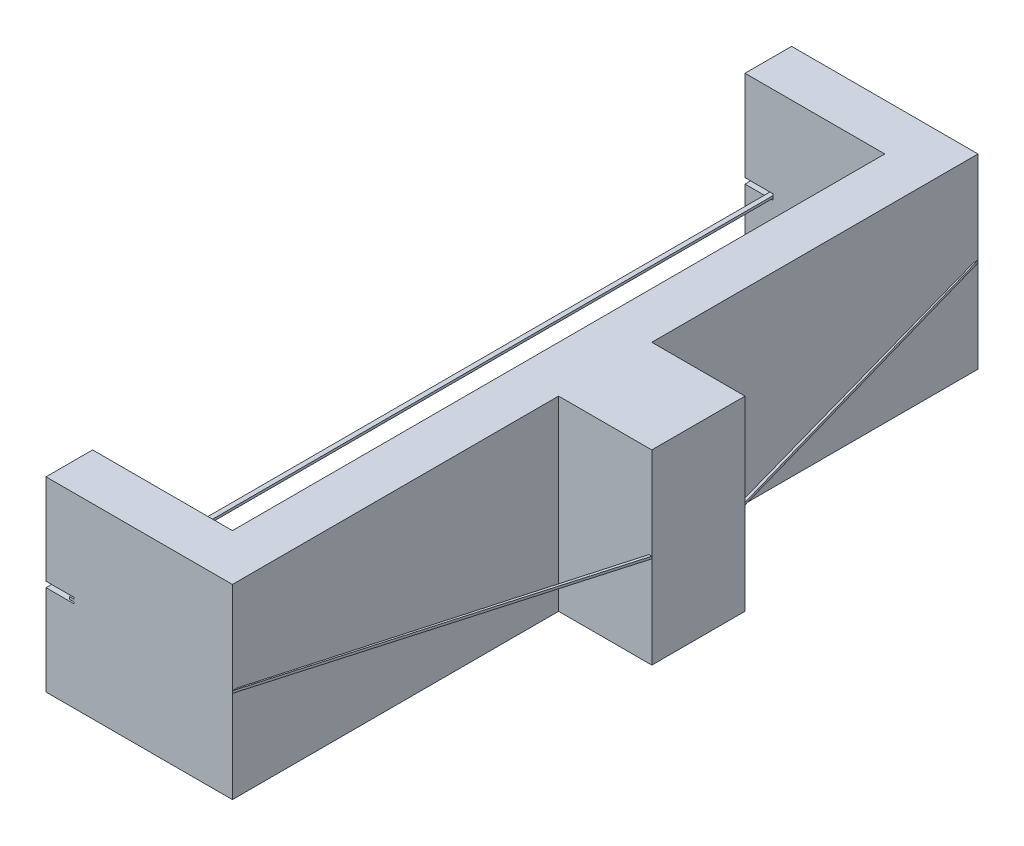
ISO-10303-21;
HEADER;
FILE_DESCRIPTION(('STEP AP214'),'2;1');
FILE_NAME('part.step','',(''),(''),'','','');
FILE_SCHEMA(('AUTOMOTIVE_DESIGN { 1 0 10303 214 1 1 1 1 }'));
ENDSEC;
DATA;
#1=APPLICATION_CONTEXT('core data for automotive mechanical design processes');
#2=APPLICATION_PROTOCOL_DEFINITION('international standard','automotive_design',2000,#1);
#3=PRODUCT_CONTEXT('',#1,'mechanical');
#4=PRODUCT('Part','Part','',(#3));
#5=PRODUCT_RELATED_PRODUCT_CATEGORY('part','',(#4));
#6=PRODUCT_DEFINITION_FORMATION('','',#4);
#7=PRODUCT_DEFINITION_CONTEXT('part definition',#1,'design');
#8=PRODUCT_DEFINITION('design','',#6,#7);
#9=PRODUCT_DEFINITION_SHAPE('','',#8);
#10=(LENGTH_UNIT() NAMED_UNIT(*) SI_UNIT(.MILLI.,.METRE.));
#11=(NAMED_UNIT(*) PLANE_ANGLE_UNIT() SI_UNIT($,.RADIAN.));
#12=(NAMED_UNIT(*) SI_UNIT($,.STERADIAN.) SOLID_ANGLE_UNIT());
#13=UNCERTAINTY_MEASURE_WITH_UNIT(LENGTH_MEASURE(1.E-05),#10,'distance_accuracy_value','');
#14=(GEOMETRIC_REPRESENTATION_CONTEXT(3) GLOBAL_UNCERTAINTY_ASSIGNED_CONTEXT((#13)) GLOBAL_UNIT_ASSIGNED_CONTEXT((#10,
#11,#12)) REPRESENTATION_CONTEXT('',''));
#15=CARTESIAN_POINT('',(0.,0.,0.));
#16=DIRECTION('',(0.,0.,1.));
#17=DIRECTION('',(1.,0.,0.));
#18=AXIS2_PLACEMENT_3D('',#15,#16,#17);
#19=CARTESIAN_POINT('',(10.,10.,5.));
#20=DIRECTION('',(-1.,0.,0.));
#21=DIRECTION('',(0.,-1.,0.));
#22=AXIS2_PLACEMENT_3D('',#19,#20,#21);
#23=PLANE('',#22);
#24=DIRECTION('',(0.,0.,1.));
#25=VECTOR('',#24,1.);
#26=CARTESIAN_POINT('',(10.,-0.125,0.));
#27=LINE('',#26,#25);
#28=CARTESIAN_POINT('',(10.,-0.125,0.));
#29=VERTEX_POINT('',#28);
#30=CARTESIAN_POINT('',(10.,-0.125,0.500000000000024));
#31=VERTEX_POINT('',#30);
#32=EDGE_CURVE('E55',#29,#31,#27,.T.);
#33=ORIENTED_EDGE('',*,*,#32,.T.);
#34=DIRECTION('',(0.,1.,0.));
#35=VECTOR('',#34,1.);
#36=CARTESIAN_POINT('',(9.99999999999999,-0.125,0.5));
#37=LINE('',#36,#35);
#38=CARTESIAN_POINT('',(10.,0.125,0.500000000000023));
#39=VERTEX_POINT('',#38);
#40=EDGE_CURVE('E59',#31,#39,#37,.T.);
#41=ORIENTED_EDGE('',*,*,#40,.T.);
#42=DIRECTION('',(0.,0.,1.));
#43=VECTOR('',#42,1.);
#44=CARTESIAN_POINT('',(10.,0.125,0.));
#45=LINE('',#44,#43);
#46=CARTESIAN_POINT('',(10.,0.125,0.));
#47=VERTEX_POINT('',#46);
#48=EDGE_CURVE('E280',#47,#39,#45,.T.);
#49=ORIENTED_EDGE('',*,*,#48,.F.);
#50=DIRECTION('',(0.,1.,0.));
#51=VECTOR('',#50,1.);
#52=CARTESIAN_POINT('',(10.,10.,0.));
#53=LINE('',#52,#51);
#54=CARTESIAN_POINT('',(10.,10.,0.));
#55=VERTEX_POINT('',#54);
#56=EDGE_CURVE('E564',#47,#55,#53,.T.);
#57=ORIENTED_EDGE('',*,*,#56,.T.);
#58=DIRECTION('',(0.,0.,-1.));
#59=VECTOR('',#58,1.);
#60=CARTESIAN_POINT('',(10.,10.,5.));
#61=LINE('',#60,#59);
#62=CARTESIAN_POINT('',(10.,10.,35.));
#63=VERTEX_POINT('',#62);
#64=EDGE_CURVE('E574',#63,#55,#61,.T.);
#65=ORIENTED_EDGE('',*,*,#64,.F.);
#66=DIRECTION('',(0.,1.,0.));
#67=VECTOR('',#66,1.);
#68=CARTESIAN_POINT('',(10.,-10.,35.));
#69=LINE('',#68,#67);
#70=CARTESIAN_POINT('',(10.,-10.,35.));
#71=VERTEX_POINT('',#70);
#72=EDGE_CURVE('E377',#71,#63,#69,.T.);
#73=ORIENTED_EDGE('',*,*,#72,.F.);
#74=DIRECTION('',(0.,0.,-1.));
#75=VECTOR('',#74,1.);
#76=CARTESIAN_POINT('',(10.,-10.,5.));
#77=LINE('',#76,#75);
#78=CARTESIAN_POINT('',(10.,-10.,0.));
#79=VERTEX_POINT('',#78);
#80=EDGE_CURVE('E579',#71,#79,#77,.T.);
#81=ORIENTED_EDGE('',*,*,#80,.T.);
#82=EDGE_CURVE('E565',#79,#29,#53,.T.);
#83=ORIENTED_EDGE('',*,*,#82,.T.);
#84=EDGE_LOOP('',(#33,#41,#49,#57,#65,#73,#81,#83));
#85=FACE_BOUND('',#84,.T.);
#86=ADVANCED_FACE('F39',(#85),#23,.F.);
#87=CARTESIAN_POINT('',(20.,-10.,35.));
#88=DIRECTION('',(0.,0.,1.));
#89=DIRECTION('',(1.,0.,0.));
#90=AXIS2_PLACEMENT_3D('',#87,#88,#89);
#91=PLANE('',#90);
#92=DIRECTION('',(1.,0.,0.));
#93=VECTOR('',#92,1.);
#94=CARTESIAN_POINT('',(19.7,-0.125,35.));
#95=LINE('',#94,#93);
#96=CARTESIAN_POINT('',(19.7,-0.125,35.));
#97=VERTEX_POINT('',#96);
#98=CARTESIAN_POINT('',(20.,-0.125,35.));
#99=VERTEX_POINT('',#98);
#100=EDGE_CURVE('E297',#97,#99,#95,.T.);
#101=ORIENTED_EDGE('',*,*,#100,.T.);
#102=DIRECTION('',(0.,1.,0.));
#103=VECTOR('',#102,1.);
#104=CARTESIAN_POINT('',(20.,-10.,35.));
#105=LINE('',#104,#103);
#106=CARTESIAN_POINT('',(20.,-10.,35.));
#107=VERTEX_POINT('',#106);
#108=EDGE_CURVE('E366',#107,#99,#105,.T.);
#109=ORIENTED_EDGE('',*,*,#108,.F.);
#110=DIRECTION('',(-1.,0.,0.));
#111=VECTOR('',#110,1.);
#112=CARTESIAN_POINT('',(20.,-10.,35.));
#113=LINE('',#112,#111);
#114=EDGE_CURVE('E388',#107,#71,#113,.T.);
#115=ORIENTED_EDGE('',*,*,#114,.T.);
#116=ORIENTED_EDGE('',*,*,#72,.T.);
#117=DIRECTION('',(-1.,0.,0.));
#118=VECTOR('',#117,1.);
#119=CARTESIAN_POINT('',(20.,10.,35.));
#120=LINE('',#119,#118);
#121=CARTESIAN_POINT('',(20.,10.,35.));
#122=VERTEX_POINT('',#121);
#123=EDGE_CURVE('E384',#122,#63,#120,.T.);
#124=ORIENTED_EDGE('',*,*,#123,.F.);
#125=CARTESIAN_POINT('',(20.,0.125,35.));
#126=VERTEX_POINT('',#125);
#127=EDGE_CURVE('E285',#126,#122,#105,.T.);
#128=ORIENTED_EDGE('',*,*,#127,.F.);
#129=DIRECTION('',(1.,0.,0.));
#130=VECTOR('',#129,1.);
#131=CARTESIAN_POINT('',(19.7,0.125,35.));
#132=LINE('',#131,#130);
#133=CARTESIAN_POINT('',(19.7,0.125,35.));
#134=VERTEX_POINT('',#133);
#135=EDGE_CURVE('E278',#134,#126,#132,.T.);
#136=ORIENTED_EDGE('',*,*,#135,.F.);
#137=DIRECTION('',(0.,1.,0.));
#138=VECTOR('',#137,1.);
#139=CARTESIAN_POINT('',(19.7,-0.125,35.));
#140=LINE('',#139,#138);
#141=EDGE_CURVE('E262',#97,#134,#140,.T.);
#142=ORIENTED_EDGE('',*,*,#141,.F.);
#143=EDGE_LOOP('',(#101,#109,#115,#116,#124,#128,#136,#142));
#144=FACE_BOUND('',#143,.T.);
#145=ADVANCED_FACE('F283',(#144),#91,.F.);
#146=DIRECTION('',(0.,1.,0.));
#147=VECTOR('',#146,1.);
#148=CARTESIAN_POINT('',(10.,-0.125,79.5));
#149=LINE('',#148,#147);
#150=CARTESIAN_POINT('',(10.,-0.125,79.5));
#151=VERTEX_POINT('',#150);
#152=CARTESIAN_POINT('',(10.,0.125,79.5));
#153=VERTEX_POINT('',#152);
#154=EDGE_CURVE('E344',#151,#153,#149,.T.);
#155=ORIENTED_EDGE('',*,*,#154,.F.);
#156=DIRECTION('',(0.,0.,1.));
#157=VECTOR('',#156,1.);
#158=CARTESIAN_POINT('',(10.,-0.125,79.5));
#159=LINE('',#158,#157);
#160=CARTESIAN_POINT('',(10.,-0.125,80.));
#161=VERTEX_POINT('',#160);
#162=EDGE_CURVE('E328',#151,#161,#159,.T.);
#163=ORIENTED_EDGE('',*,*,#162,.T.);
#164=DIRECTION('',(0.,1.,0.));
#165=VECTOR('',#164,1.);
#166=CARTESIAN_POINT('',(10.,10.,80.));
#167=LINE('',#166,#165);
#168=CARTESIAN_POINT('',(10.,-10.,80.));
#169=VERTEX_POINT('',#168);
#170=EDGE_CURVE('E491',#169,#161,#167,.T.);
#171=ORIENTED_EDGE('',*,*,#170,.F.);
#172=CARTESIAN_POINT('',(10.,-10.,45.));
#173=VERTEX_POINT('',#172);
#174=EDGE_CURVE('E580',#169,#173,#77,.T.);
#175=ORIENTED_EDGE('',*,*,#174,.T.);
#176=DIRECTION('',(0.,-1.,0.));
#177=VECTOR('',#176,1.);
#178=CARTESIAN_POINT('',(10.,-10.,45.));
#179=LINE('',#178,#177);
#180=CARTESIAN_POINT('',(10.,10.,45.));
#181=VERTEX_POINT('',#180);
#182=EDGE_CURVE('E347',#181,#173,#179,.T.);
#183=ORIENTED_EDGE('',*,*,#182,.F.);
#184=CARTESIAN_POINT('',(10.,10.,80.));
#185=VERTEX_POINT('',#184);
#186=EDGE_CURVE('E575',#185,#181,#61,.T.);
#187=ORIENTED_EDGE('',*,*,#186,.F.);
#188=CARTESIAN_POINT('',(10.,0.125,80.));
#189=VERTEX_POINT('',#188);
#190=EDGE_CURVE('E496',#189,#185,#167,.T.);
#191=ORIENTED_EDGE('',*,*,#190,.F.);
#192=DIRECTION('',(0.,0.,1.));
#193=VECTOR('',#192,1.);
#194=CARTESIAN_POINT('',(10.,0.125,79.5));
#195=LINE('',#194,#193);
#196=EDGE_CURVE('E308',#153,#189,#195,.T.);
#197=ORIENTED_EDGE('',*,*,#196,.F.);
#198=EDGE_LOOP('',(#155,#163,#171,#175,#183,#187,#191,#197));
#199=FACE_BOUND('',#198,.T.);
#200=ADVANCED_FACE('F651',(#199),#23,.F.);
#201=CARTESIAN_POINT('',(-7.,0.299999999999999,-9.99999999999998));
#202=DIRECTION('',(1.,0.,0.));
#203=DIRECTION('',(0.,0.,-1.));
#204=AXIS2_PLACEMENT_3D('',#201,#202,#203);
#205=PLANE('',#204);
#206=DIRECTION('',(0.,0.,1.));
#207=VECTOR('',#206,1.);
#208=CARTESIAN_POINT('',(-7.,-0.125,0.));
#209=LINE('',#208,#207);
#210=CARTESIAN_POINT('',(-7.,-0.125,75.));
#211=VERTEX_POINT('',#210);
#212=CARTESIAN_POINT('',(-7.,-0.125,80.));
#213=VERTEX_POINT('',#212);
#214=EDGE_CURVE('E396',#211,#213,#209,.T.);
#215=ORIENTED_EDGE('',*,*,#214,.F.);
#216=DIRECTION('',(0.,-1.,0.));
#217=VECTOR('',#216,1.);
#218=CARTESIAN_POINT('',(-7.,0.,75.));
#219=LINE('',#218,#217);
#220=CARTESIAN_POINT('',(-7.,-0.300000000000001,75.));
#221=VERTEX_POINT('',#220);
#222=EDGE_CURVE('E590',#211,#221,#219,.T.);
#223=ORIENTED_EDGE('',*,*,#222,.T.);
#224=DIRECTION('',(0.,0.,1.));
#225=VECTOR('',#224,1.);
#226=CARTESIAN_POINT('',(-7.,-0.300000000000001,-9.99999999999998));
#227=LINE('',#226,#225);
#228=CARTESIAN_POINT('',(-7.,-0.300000000000001,80.));
#229=VERTEX_POINT('',#228);
#230=EDGE_CURVE('E459',#221,#229,#227,.T.);
#231=ORIENTED_EDGE('',*,*,#230,.T.);
#232=DIRECTION('',(0.,1.,0.));
#233=VECTOR('',#232,1.);
#234=CARTESIAN_POINT('',(-7.,0.299999999999999,80.));
#235=LINE('',#234,#233);
#236=EDGE_CURVE('E441',#229,#213,#235,.T.);
#237=ORIENTED_EDGE('',*,*,#236,.T.);
#238=EDGE_LOOP('',(#215,#223,#231,#237));
#239=FACE_BOUND('',#238,.T.);
#240=ADVANCED_FACE('F730',(#239),#205,.F.);
#241=DIRECTION('',(0.,0.,-1.));
#242=VECTOR('',#241,1.);
#243=CARTESIAN_POINT('',(-7.,0.125,0.));
#244=LINE('',#243,#242);
#245=CARTESIAN_POINT('',(-7.,0.125,80.));
#246=VERTEX_POINT('',#245);
#247=CARTESIAN_POINT('',(-7.,0.125,75.));
#248=VERTEX_POINT('',#247);
#249=EDGE_CURVE('E402',#246,#248,#244,.T.);
#250=ORIENTED_EDGE('',*,*,#249,.F.);
#251=CARTESIAN_POINT('',(-7.,0.299999999999999,80.));
#252=VERTEX_POINT('',#251);
#253=EDGE_CURVE('E440',#246,#252,#235,.T.);
#254=ORIENTED_EDGE('',*,*,#253,.T.);
#255=DIRECTION('',(0.,0.,1.));
#256=VECTOR('',#255,1.);
#257=CARTESIAN_POINT('',(-7.,0.299999999999999,-9.99999999999998));
#258=LINE('',#257,#256);
#259=CARTESIAN_POINT('',(-7.,0.299999999999999,75.));
#260=VERTEX_POINT('',#259);
#261=EDGE_CURVE('E454',#260,#252,#258,.T.);
#262=ORIENTED_EDGE('',*,*,#261,.F.);
#263=EDGE_CURVE('E591',#260,#248,#219,.T.);
#264=ORIENTED_EDGE('',*,*,#263,.T.);
#265=EDGE_LOOP('',(#250,#254,#262,#264));
#266=FACE_BOUND('',#265,.T.);
#267=ADVANCED_FACE('F604',(#266),#205,.F.);
#268=CARTESIAN_POINT('',(-7.,-0.125,0.));
#269=VERTEX_POINT('',#268);
#270=CARTESIAN_POINT('',(-7.,-0.125,5.));
#271=VERTEX_POINT('',#270);
#272=EDGE_CURVE('E412',#269,#271,#209,.T.);
#273=ORIENTED_EDGE('',*,*,#272,.F.);
#274=DIRECTION('',(0.,1.,0.));
#275=VECTOR('',#274,1.);
#276=CARTESIAN_POINT('',(-7.,0.,0.));
#277=LINE('',#276,#275);
#278=CARTESIAN_POINT('',(-7.,-0.300000000000001,0.));
#279=VERTEX_POINT('',#278);
#280=EDGE_CURVE('E473',#279,#269,#277,.T.);
#281=ORIENTED_EDGE('',*,*,#280,.F.);
#282=CARTESIAN_POINT('',(-7.,-0.300000000000001,5.));
#283=VERTEX_POINT('',#282);
#284=EDGE_CURVE('E458',#279,#283,#227,.T.);
#285=ORIENTED_EDGE('',*,*,#284,.T.);
#286=DIRECTION('',(0.,1.,0.));
#287=VECTOR('',#286,1.);
#288=CARTESIAN_POINT('',(-7.,0.,5.));
#289=LINE('',#288,#287);
#290=EDGE_CURVE('E478',#283,#271,#289,.T.);
#291=ORIENTED_EDGE('',*,*,#290,.T.);
#292=EDGE_LOOP('',(#273,#281,#285,#291));
#293=FACE_BOUND('',#292,.T.);
#294=ADVANCED_FACE('F759',(#293),#205,.F.);
#295=DIRECTION('',(0.,0.,-1.));
#296=VECTOR('',#295,1.);
#297=CARTESIAN_POINT('',(-7.,0.125,-9.99999999999998));
#298=LINE('',#297,#296);
#299=CARTESIAN_POINT('',(-7.,0.125,5.));
#300=VERTEX_POINT('',#299);
#301=CARTESIAN_POINT('',(-7.,0.125,0.));
#302=VERTEX_POINT('',#301);
#303=EDGE_CURVE('E11',#300,#302,#298,.T.);
#304=ORIENTED_EDGE('',*,*,#303,.F.);
#305=CARTESIAN_POINT('',(-7.,0.299999999999999,5.));
#306=VERTEX_POINT('',#305);
#307=EDGE_CURVE('E477',#300,#306,#289,.T.);
#308=ORIENTED_EDGE('',*,*,#307,.T.);
#309=CARTESIAN_POINT('',(-7.,0.299999999999999,0.));
#310=VERTEX_POINT('',#309);
#311=EDGE_CURVE('E453',#310,#306,#258,.T.);
#312=ORIENTED_EDGE('',*,*,#311,.F.);
#313=EDGE_CURVE('E472',#302,#310,#277,.T.);
#314=ORIENTED_EDGE('',*,*,#313,.F.);
#315=EDGE_LOOP('',(#304,#308,#312,#314));
#316=FACE_BOUND('',#315,.T.);
#317=ADVANCED_FACE('F718',(#316),#205,.F.);
#318=CARTESIAN_POINT('',(-10.,10.,5.));
#319=DIRECTION('',(1.,0.,0.));
#320=DIRECTION('',(0.,0.,-1.));
#321=AXIS2_PLACEMENT_3D('',#318,#319,#320);
#322=PLANE('',#321);
#323=DIRECTION('',(0.,-1.,0.));
#324=VECTOR('',#323,1.);
#325=CARTESIAN_POINT('',(-10.,10.,0.));
#326=LINE('',#325,#324);
#327=CARTESIAN_POINT('',(-10.,10.,0.));
#328=VERTEX_POINT('',#327);
#329=CARTESIAN_POINT('',(-10.,0.299999999999999,0.));
#330=VERTEX_POINT('',#329);
#331=EDGE_CURVE('E556',#328,#330,#326,.T.);
#332=ORIENTED_EDGE('',*,*,#331,.T.);
#333=DIRECTION('',(0.,0.,1.));
#334=VECTOR('',#333,1.);
#335=CARTESIAN_POINT('',(-10.,0.299999999999999,-9.99999999999998));
#336=LINE('',#335,#334);
#337=CARTESIAN_POINT('',(-10.,0.299999999999999,5.));
#338=VERTEX_POINT('',#337);
#339=EDGE_CURVE('E452',#330,#338,#336,.T.);
#340=ORIENTED_EDGE('',*,*,#339,.T.);
#341=DIRECTION('',(0.,-1.,0.));
#342=VECTOR('',#341,1.);
#343=CARTESIAN_POINT('',(-10.,10.,5.));
#344=LINE('',#343,#342);
#345=CARTESIAN_POINT('',(-10.,10.,5.));
#346=VERTEX_POINT('',#345);
#347=EDGE_CURVE('E544',#346,#338,#344,.T.);
#348=ORIENTED_EDGE('',*,*,#347,.F.);
#349=DIRECTION('',(0.,0.,-1.));
#350=VECTOR('',#349,1.);
#351=CARTESIAN_POINT('',(-10.,10.,5.));
#352=LINE('',#351,#350);
#353=EDGE_CURVE('E555',#346,#328,#352,.T.);
#354=ORIENTED_EDGE('',*,*,#353,.T.);
#355=EDGE_LOOP('',(#332,#340,#348,#354));
#356=FACE_BOUND('',#355,.T.);
#357=ADVANCED_FACE('F711',(#356),#322,.F.);
#358=CARTESIAN_POINT('',(-10.,10.,80.));
#359=DIRECTION('',(1.,0.,0.));
#360=DIRECTION('',(0.,0.,-1.));
#361=AXIS2_PLACEMENT_3D('',#358,#359,#360);
#362=PLANE('',#361);
#363=DIRECTION('',(0.,-1.,0.));
#364=VECTOR('',#363,1.);
#365=CARTESIAN_POINT('',(-10.,10.,75.));
#366=LINE('',#365,#364);
#367=CARTESIAN_POINT('',(-10.,10.,75.));
#368=VERTEX_POINT('',#367);
#369=CARTESIAN_POINT('',(-10.,0.299999999999999,75.));
#370=VERTEX_POINT('',#369);
#371=EDGE_CURVE('E512',#368,#370,#366,.T.);
#372=ORIENTED_EDGE('',*,*,#371,.T.);
#373=CARTESIAN_POINT('',(-10.,0.299999999999999,80.));
#374=VERTEX_POINT('',#373);
#375=EDGE_CURVE('E448',#370,#374,#336,.T.);
#376=ORIENTED_EDGE('',*,*,#375,.T.);
#377=DIRECTION('',(0.,-1.,0.));
#378=VECTOR('',#377,1.);
#379=CARTESIAN_POINT('',(-10.,10.,80.));
#380=LINE('',#379,#378);
#381=CARTESIAN_POINT('',(-10.,10.,80.));
#382=VERTEX_POINT('',#381);
#383=EDGE_CURVE('E500',#382,#374,#380,.T.);
#384=ORIENTED_EDGE('',*,*,#383,.F.);
#385=DIRECTION('',(0.,0.,-1.));
#386=VECTOR('',#385,1.);
#387=CARTESIAN_POINT('',(-10.,10.,80.));
#388=LINE('',#387,#386);
#389=EDGE_CURVE('E523',#382,#368,#388,.T.);
#390=ORIENTED_EDGE('',*,*,#389,.T.);
#391=EDGE_LOOP('',(#372,#376,#384,#390));
#392=FACE_BOUND('',#391,.T.);
#393=ADVANCED_FACE('F765',(#392),#362,.F.);
#394=CARTESIAN_POINT('',(-10.,-0.300000000000001,5.));
#395=VERTEX_POINT('',#394);
#396=CARTESIAN_POINT('',(-10.,-10.,5.));
#397=VERTEX_POINT('',#396);
#398=EDGE_CURVE('E549',#395,#397,#344,.T.);
#399=ORIENTED_EDGE('',*,*,#398,.F.);
#400=DIRECTION('',(0.,0.,1.));
#401=VECTOR('',#400,1.);
#402=CARTESIAN_POINT('',(-10.,-0.300000000000001,-9.99999999999998));
#403=LINE('',#402,#401);
#404=CARTESIAN_POINT('',(-10.,-0.300000000000001,0.));
#405=VERTEX_POINT('',#404);
#406=EDGE_CURVE('E462',#405,#395,#403,.T.);
#407=ORIENTED_EDGE('',*,*,#406,.F.);
#408=CARTESIAN_POINT('',(-10.,-10.,0.));
#409=VERTEX_POINT('',#408);
#410=EDGE_CURVE('E543',#405,#409,#326,.T.);
#411=ORIENTED_EDGE('',*,*,#410,.T.);
#412=DIRECTION('',(0.,0.,-1.));
#413=VECTOR('',#412,1.);
#414=CARTESIAN_POINT('',(-10.,-10.,5.));
#415=LINE('',#414,#413);
#416=EDGE_CURVE('E583',#397,#409,#415,.T.);
#417=ORIENTED_EDGE('',*,*,#416,.F.);
#418=EDGE_LOOP('',(#399,#407,#411,#417));
#419=FACE_BOUND('',#418,.T.);
#420=ADVANCED_FACE('F41',(#419),#322,.F.);
#421=CARTESIAN_POINT('',(-10.,-10.,5.));
#422=DIRECTION('',(0.,1.,0.));
#423=DIRECTION('',(0.,0.,1.));
#424=AXIS2_PLACEMENT_3D('',#421,#422,#423);
#425=PLANE('',#424);
#426=DIRECTION('',(1.,0.,0.));
#427=VECTOR('',#426,1.);
#428=CARTESIAN_POINT('',(-10.,-10.,0.));
#429=LINE('',#428,#427);
#430=EDGE_CURVE('E560',#409,#79,#429,.T.);
#431=ORIENTED_EDGE('',*,*,#430,.T.);
#432=ORIENTED_EDGE('',*,*,#80,.F.);
#433=ORIENTED_EDGE('',*,*,#114,.F.);
#434=DIRECTION('',(0.,0.,-1.));
#435=VECTOR('',#434,1.);
#436=CARTESIAN_POINT('',(20.,-10.,45.));
#437=LINE('',#436,#435);
#438=CARTESIAN_POINT('',(20.,-10.,45.));
#439=VERTEX_POINT('',#438);
#440=EDGE_CURVE('E362',#439,#107,#437,.T.);
#441=ORIENTED_EDGE('',*,*,#440,.F.);
#442=DIRECTION('',(-1.,0.,0.));
#443=VECTOR('',#442,1.);
#444=CARTESIAN_POINT('',(20.,-10.,45.));
#445=LINE('',#444,#443);
#446=EDGE_CURVE('E392',#439,#173,#445,.T.);
#447=ORIENTED_EDGE('',*,*,#446,.T.);
#448=ORIENTED_EDGE('',*,*,#174,.F.);
#449=DIRECTION('',(1.,0.,0.));
#450=VECTOR('',#449,1.);
#451=CARTESIAN_POINT('',(10.,-10.,80.));
#452=LINE('',#451,#450);
#453=CARTESIAN_POINT('',(-10.,-10.,80.));
#454=VERTEX_POINT('',#453);
#455=EDGE_CURVE('E504',#454,#169,#452,.T.);
#456=ORIENTED_EDGE('',*,*,#455,.F.);
#457=DIRECTION('',(0.,0.,-1.));
#458=VECTOR('',#457,1.);
#459=CARTESIAN_POINT('',(-10.,-10.,80.));
#460=LINE('',#459,#458);
#461=CARTESIAN_POINT('',(-10.,-10.,75.));
#462=VERTEX_POINT('',#461);
#463=EDGE_CURVE('E508',#454,#462,#460,.T.);
#464=ORIENTED_EDGE('',*,*,#463,.T.);
#465=DIRECTION('',(1.,0.,0.));
#466=VECTOR('',#465,1.);
#467=CARTESIAN_POINT('',(10.,-10.,75.));
#468=LINE('',#467,#466);
#469=CARTESIAN_POINT('',(5.,-10.,75.));
#470=VERTEX_POINT('',#469);
#471=EDGE_CURVE('E516',#462,#470,#468,.T.);
#472=ORIENTED_EDGE('',*,*,#471,.T.);
#473=DIRECTION('',(0.,0.,-1.));
#474=VECTOR('',#473,1.);
#475=CARTESIAN_POINT('',(5.,-10.,75.));
#476=LINE('',#475,#474);
#477=CARTESIAN_POINT('',(5.,-10.,5.));
#478=VERTEX_POINT('',#477);
#479=EDGE_CURVE('E532',#470,#478,#476,.T.);
#480=ORIENTED_EDGE('',*,*,#479,.T.);
#481=DIRECTION('',(1.,0.,0.));
#482=VECTOR('',#481,1.);
#483=CARTESIAN_POINT('',(-10.,-10.,5.));
#484=LINE('',#483,#482);
#485=EDGE_CURVE('E548',#397,#478,#484,.T.);
#486=ORIENTED_EDGE('',*,*,#485,.F.);
#487=ORIENTED_EDGE('',*,*,#416,.T.);
#488=EDGE_LOOP('',(#431,#432,#433,#441,#447,#448,#456,#464,#472,#480,#486,#487));
#489=FACE_BOUND('',#488,.T.);
#490=ADVANCED_FACE('F642',(#489),#425,.F.);
#491=CARTESIAN_POINT('',(-10.,10.,5.));
#492=DIRECTION('',(0.,-1.,0.));
#493=DIRECTION('',(0.,0.,-1.));
#494=AXIS2_PLACEMENT_3D('',#491,#492,#493);
#495=PLANE('',#494);
#496=DIRECTION('',(-1.,0.,0.));
#497=VECTOR('',#496,1.);
#498=CARTESIAN_POINT('',(-10.,10.,0.));
#499=LINE('',#498,#497);
#500=EDGE_CURVE('E568',#55,#328,#499,.T.);
#501=ORIENTED_EDGE('',*,*,#500,.T.);
#502=ORIENTED_EDGE('',*,*,#353,.F.);
#503=DIRECTION('',(-1.,0.,0.));
#504=VECTOR('',#503,1.);
#505=CARTESIAN_POINT('',(-10.,10.,5.));
#506=LINE('',#505,#504);
#507=CARTESIAN_POINT('',(5.,10.,5.));
#508=VERTEX_POINT('',#507);
#509=EDGE_CURVE('E552',#508,#346,#506,.T.);
#510=ORIENTED_EDGE('',*,*,#509,.F.);
#511=DIRECTION('',(0.,0.,-1.));
#512=VECTOR('',#511,1.);
#513=CARTESIAN_POINT('',(5.,10.,75.));
#514=LINE('',#513,#512);
#515=CARTESIAN_POINT('',(5.,10.,75.));
#516=VERTEX_POINT('',#515);
#517=EDGE_CURVE('E539',#516,#508,#514,.T.);
#518=ORIENTED_EDGE('',*,*,#517,.F.);
#519=DIRECTION('',(-1.,0.,0.));
#520=VECTOR('',#519,1.);
#521=CARTESIAN_POINT('',(10.,10.,75.));
#522=LINE('',#521,#520);
#523=EDGE_CURVE('E490',#516,#368,#522,.T.);
#524=ORIENTED_EDGE('',*,*,#523,.T.);
#525=ORIENTED_EDGE('',*,*,#389,.F.);
#526=DIRECTION('',(-1.,0.,0.));
#527=VECTOR('',#526,1.);
#528=CARTESIAN_POINT('',(10.,10.,80.));
#529=LINE('',#528,#527);
#530=EDGE_CURVE('E495',#185,#382,#529,.T.);
#531=ORIENTED_EDGE('',*,*,#530,.F.);
#532=ORIENTED_EDGE('',*,*,#186,.T.);
#533=DIRECTION('',(-1.,0.,0.));
#534=VECTOR('',#533,1.);
#535=CARTESIAN_POINT('',(20.,10.,45.));
#536=LINE('',#535,#534);
#537=CARTESIAN_POINT('',(20.,10.,45.));
#538=VERTEX_POINT('',#537);
#539=EDGE_CURVE('E373',#538,#181,#536,.T.);
#540=ORIENTED_EDGE('',*,*,#539,.F.);
#541=DIRECTION('',(0.,0.,1.));
#542=VECTOR('',#541,1.);
#543=CARTESIAN_POINT('',(20.,10.,45.));
#544=LINE('',#543,#542);
#545=EDGE_CURVE('E370',#122,#538,#544,.T.);
#546=ORIENTED_EDGE('',*,*,#545,.F.);
#547=ORIENTED_EDGE('',*,*,#123,.T.);
#548=ORIENTED_EDGE('',*,*,#64,.T.);
#549=EDGE_LOOP('',(#501,#502,#510,#518,#524,#525,#531,#532,#540,#546,#547,#548));
#550=FACE_BOUND('',#549,.T.);
#551=ADVANCED_FACE('F656',(#550),#495,.F.);
#552=CARTESIAN_POINT('',(0.,0.,5.));
#553=DIRECTION('',(0.,0.,1.));
#554=DIRECTION('',(1.,0.,0.));
#555=AXIS2_PLACEMENT_3D('',#552,#553,#554);
#556=PLANE('',#555);
#557=DIRECTION('',(-1.,0.,0.));
#558=VECTOR('',#557,1.);
#559=CARTESIAN_POINT('',(0.,0.299999999999999,5.));
#560=LINE('',#559,#558);
#561=EDGE_CURVE('E487',#306,#338,#560,.T.);
#562=ORIENTED_EDGE('',*,*,#561,.F.);
#563=ORIENTED_EDGE('',*,*,#307,.F.);
#564=EDGE_CURVE('E483',#271,#300,#289,.T.);
#565=ORIENTED_EDGE('',*,*,#564,.F.);
#566=ORIENTED_EDGE('',*,*,#290,.F.);
#567=DIRECTION('',(1.,0.,0.));
#568=VECTOR('',#567,1.);
#569=CARTESIAN_POINT('',(0.,-0.3,5.));
#570=LINE('',#569,#568);
#571=EDGE_CURVE('E469',#395,#283,#570,.T.);
#572=ORIENTED_EDGE('',*,*,#571,.F.);
#573=ORIENTED_EDGE('',*,*,#398,.T.);
#574=ORIENTED_EDGE('',*,*,#485,.T.);
#575=DIRECTION('',(0.,-1.,0.));
#576=VECTOR('',#575,1.);
#577=CARTESIAN_POINT('',(5.,-10.,5.));
#578=LINE('',#577,#576);
#579=EDGE_CURVE('E527',#508,#478,#578,.T.);
#580=ORIENTED_EDGE('',*,*,#579,.F.);
#581=ORIENTED_EDGE('',*,*,#509,.T.);
#582=ORIENTED_EDGE('',*,*,#347,.T.);
#583=EDGE_LOOP('',(#562,#563,#565,#566,#572,#573,#574,#580,#581,#582));
#584=FACE_BOUND('',#583,.T.);
#585=ADVANCED_FACE('F683',(#584),#556,.T.);
#586=CARTESIAN_POINT('',(0.,0.,0.));
#587=DIRECTION('',(0.,0.,1.));
#588=DIRECTION('',(1.,0.,0.));
#589=AXIS2_PLACEMENT_3D('',#586,#587,#588);
#590=PLANE('',#589);
#591=ORIENTED_EDGE('',*,*,#280,.T.);
#592=DIRECTION('',(1.,0.,0.));
#593=VECTOR('',#592,1.);
#594=CARTESIAN_POINT('',(-7.5,-0.125,0.));
#595=LINE('',#594,#593);
#596=CARTESIAN_POINT('',(-7.5,-0.125,0.));
#597=VERTEX_POINT('',#596);
#598=EDGE_CURVE('E432',#597,#269,#595,.T.);
#599=ORIENTED_EDGE('',*,*,#598,.F.);
#600=DIRECTION('',(0.,-1.,0.));
#601=VECTOR('',#600,1.);
#602=CARTESIAN_POINT('',(-7.5,0.125,0.));
#603=LINE('',#602,#601);
#604=CARTESIAN_POINT('',(-7.5,0.125,0.));
#605=VERTEX_POINT('',#604);
#606=EDGE_CURVE('E397',#605,#597,#603,.T.);
#607=ORIENTED_EDGE('',*,*,#606,.F.);
#608=DIRECTION('',(1.,0.,0.));
#609=VECTOR('',#608,1.);
#610=CARTESIAN_POINT('',(-7.5,0.125,0.));
#611=LINE('',#610,#609);
#612=EDGE_CURVE('E411',#605,#302,#611,.T.);
#613=ORIENTED_EDGE('',*,*,#612,.T.);
#614=ORIENTED_EDGE('',*,*,#313,.T.);
#615=DIRECTION('',(-1.,0.,0.));
#616=VECTOR('',#615,1.);
#617=CARTESIAN_POINT('',(0.,0.299999999999999,0.));
#618=LINE('',#617,#616);
#619=EDGE_CURVE('E482',#310,#330,#618,.T.);
#620=ORIENTED_EDGE('',*,*,#619,.T.);
#621=ORIENTED_EDGE('',*,*,#331,.F.);
#622=ORIENTED_EDGE('',*,*,#500,.F.);
#623=ORIENTED_EDGE('',*,*,#56,.F.);
#624=DIRECTION('',(0.,1.,0.));
#625=VECTOR('',#624,1.);
#626=CARTESIAN_POINT('',(10.,-0.125,0.));
#627=LINE('',#626,#625);
#628=EDGE_CURVE('E309',#29,#47,#627,.T.);
#629=ORIENTED_EDGE('',*,*,#628,.F.);
#630=ORIENTED_EDGE('',*,*,#82,.F.);
#631=ORIENTED_EDGE('',*,*,#430,.F.);
#632=ORIENTED_EDGE('',*,*,#410,.F.);
#633=DIRECTION('',(1.,0.,0.));
#634=VECTOR('',#633,1.);
#635=CARTESIAN_POINT('',(0.,-0.3,0.));
#636=LINE('',#635,#634);
#637=EDGE_CURVE('E465',#405,#279,#636,.T.);
#638=ORIENTED_EDGE('',*,*,#637,.T.);
#639=EDGE_LOOP('',(#591,#599,#607,#613,#614,#620,#621,#622,#623,#629,#630,#631,#632,#638));
#640=FACE_BOUND('',#639,.T.);
#641=ADVANCED_FACE('F722',(#640),#590,.F.);
#642=CARTESIAN_POINT('',(5.,-10.,75.));
#643=DIRECTION('',(1.,0.,0.));
#644=DIRECTION('',(0.,1.,0.));
#645=AXIS2_PLACEMENT_3D('',#642,#643,#644);
#646=PLANE('',#645);
#647=ORIENTED_EDGE('',*,*,#579,.T.);
#648=ORIENTED_EDGE('',*,*,#479,.F.);
#649=DIRECTION('',(0.,-1.,0.));
#650=VECTOR('',#649,1.);
#651=CARTESIAN_POINT('',(5.,-10.,75.));
#652=LINE('',#651,#650);
#653=EDGE_CURVE('E528',#516,#470,#652,.T.);
#654=ORIENTED_EDGE('',*,*,#653,.F.);
#655=ORIENTED_EDGE('',*,*,#517,.T.);
#656=EDGE_LOOP('',(#647,#648,#654,#655));
#657=FACE_BOUND('',#656,.T.);
#658=ADVANCED_FACE('F703',(#657),#646,.F.);
#659=CARTESIAN_POINT('',(-10.,-0.300000000000001,80.));
#660=VERTEX_POINT('',#659);
#661=EDGE_CURVE('E499',#660,#454,#380,.T.);
#662=ORIENTED_EDGE('',*,*,#661,.F.);
#663=CARTESIAN_POINT('',(-10.,-0.300000000000001,75.));
#664=VERTEX_POINT('',#663);
#665=EDGE_CURVE('E447',#664,#660,#403,.T.);
#666=ORIENTED_EDGE('',*,*,#665,.F.);
#667=EDGE_CURVE('E511',#664,#462,#366,.T.);
#668=ORIENTED_EDGE('',*,*,#667,.T.);
#669=ORIENTED_EDGE('',*,*,#463,.F.);
#670=EDGE_LOOP('',(#662,#666,#668,#669));
#671=FACE_BOUND('',#670,.T.);
#672=ADVANCED_FACE('F697',(#671),#362,.F.);
#673=CARTESIAN_POINT('',(0.,0.,80.));
#674=DIRECTION('',(0.,0.,-1.));
#675=DIRECTION('',(-1.,0.,0.));
#676=AXIS2_PLACEMENT_3D('',#673,#674,#675);
#677=PLANE('',#676);
#678=ORIENTED_EDGE('',*,*,#383,.T.);
#679=DIRECTION('',(-1.,0.,0.));
#680=VECTOR('',#679,1.);
#681=CARTESIAN_POINT('',(-10.,0.299999999999999,80.));
#682=LINE('',#681,#680);
#683=EDGE_CURVE('E444',#252,#374,#682,.T.);
#684=ORIENTED_EDGE('',*,*,#683,.F.);
#685=ORIENTED_EDGE('',*,*,#253,.F.);
#686=DIRECTION('',(1.,0.,0.));
#687=VECTOR('',#686,1.);
#688=CARTESIAN_POINT('',(-7.5,0.125,80.));
#689=LINE('',#688,#687);
#690=CARTESIAN_POINT('',(-7.5,0.125,80.));
#691=VERTEX_POINT('',#690);
#692=EDGE_CURVE('E424',#691,#246,#689,.T.);
#693=ORIENTED_EDGE('',*,*,#692,.F.);
#694=DIRECTION('',(0.,1.,0.));
#695=VECTOR('',#694,1.);
#696=CARTESIAN_POINT('',(-7.5,0.125,80.));
#697=LINE('',#696,#695);
#698=CARTESIAN_POINT('',(-7.5,-0.125,80.));
#699=VERTEX_POINT('',#698);
#700=EDGE_CURVE('E405',#699,#691,#697,.T.);
#701=ORIENTED_EDGE('',*,*,#700,.F.);
#702=DIRECTION('',(1.,0.,0.));
#703=VECTOR('',#702,1.);
#704=CARTESIAN_POINT('',(-7.5,-0.125,80.));
#705=LINE('',#704,#703);
#706=EDGE_CURVE('E428',#699,#213,#705,.T.);
#707=ORIENTED_EDGE('',*,*,#706,.T.);
#708=ORIENTED_EDGE('',*,*,#236,.F.);
#709=DIRECTION('',(1.,0.,0.));
#710=VECTOR('',#709,1.);
#711=CARTESIAN_POINT('',(-7.,-0.300000000000001,80.));
#712=LINE('',#711,#710);
#713=EDGE_CURVE('E436',#660,#229,#712,.T.);
#714=ORIENTED_EDGE('',*,*,#713,.F.);
#715=ORIENTED_EDGE('',*,*,#661,.T.);
#716=ORIENTED_EDGE('',*,*,#455,.T.);
#717=ORIENTED_EDGE('',*,*,#170,.T.);
#718=DIRECTION('',(0.,1.,0.));
#719=VECTOR('',#718,1.);
#720=CARTESIAN_POINT('',(10.,-0.125,80.));
#721=LINE('',#720,#719);
#722=EDGE_CURVE('E343',#161,#189,#721,.T.);
#723=ORIENTED_EDGE('',*,*,#722,.T.);
#724=ORIENTED_EDGE('',*,*,#190,.T.);
#725=ORIENTED_EDGE('',*,*,#530,.T.);
#726=EDGE_LOOP('',(#678,#684,#685,#693,#701,#707,#708,#714,#715,#716,#717,#723,#724,#725));
#727=FACE_BOUND('',#726,.T.);
#728=ADVANCED_FACE('F625',(#727),#677,.F.);
#729=CARTESIAN_POINT('',(0.,0.,75.));
#730=DIRECTION('',(0.,0.,-1.));
#731=DIRECTION('',(-1.,0.,0.));
#732=AXIS2_PLACEMENT_3D('',#729,#730,#731);
#733=PLANE('',#732);
#734=DIRECTION('',(1.,0.,0.));
#735=VECTOR('',#734,1.);
#736=CARTESIAN_POINT('',(0.,0.299999999999999,75.));
#737=LINE('',#736,#735);
#738=EDGE_CURVE('E48',#370,#260,#737,.T.);
#739=ORIENTED_EDGE('',*,*,#738,.F.);
#740=ORIENTED_EDGE('',*,*,#371,.F.);
#741=ORIENTED_EDGE('',*,*,#523,.F.);
#742=ORIENTED_EDGE('',*,*,#653,.T.);
#743=ORIENTED_EDGE('',*,*,#471,.F.);
#744=ORIENTED_EDGE('',*,*,#667,.F.);
#745=DIRECTION('',(-1.,0.,0.));
#746=VECTOR('',#745,1.);
#747=CARTESIAN_POINT('',(0.,-0.3,75.));
#748=LINE('',#747,#746);
#749=EDGE_CURVE('E587',#221,#664,#748,.T.);
#750=ORIENTED_EDGE('',*,*,#749,.F.);
#751=ORIENTED_EDGE('',*,*,#222,.F.);
#752=EDGE_CURVE('E593',#248,#211,#219,.T.);
#753=ORIENTED_EDGE('',*,*,#752,.F.);
#754=ORIENTED_EDGE('',*,*,#263,.F.);
#755=EDGE_LOOP('',(#739,#740,#741,#742,#743,#744,#750,#751,#753,#754));
#756=FACE_BOUND('',#755,.T.);
#757=ADVANCED_FACE('F607',(#756),#733,.T.);
#758=CARTESIAN_POINT('',(-7.,-0.300000000000001,-9.99999999999998));
#759=DIRECTION('',(0.,-1.,0.));
#760=DIRECTION('',(1.,0.,0.));
#761=AXIS2_PLACEMENT_3D('',#758,#759,#760);
#762=PLANE('',#761);
#763=ORIENTED_EDGE('',*,*,#749,.T.);
#764=ORIENTED_EDGE('',*,*,#665,.T.);
#765=ORIENTED_EDGE('',*,*,#713,.T.);
#766=ORIENTED_EDGE('',*,*,#230,.F.);
#767=EDGE_LOOP('',(#763,#764,#765,#766));
#768=FACE_BOUND('',#767,.T.);
#769=ADVANCED_FACE('F733',(#768),#762,.F.);
#770=CARTESIAN_POINT('',(-10.,0.299999999999999,-9.99999999999998));
#771=DIRECTION('',(0.,1.,0.));
#772=DIRECTION('',(-1.,0.,0.));
#773=AXIS2_PLACEMENT_3D('',#770,#771,#772);
#774=PLANE('',#773);
#775=ORIENTED_EDGE('',*,*,#738,.T.);
#776=ORIENTED_EDGE('',*,*,#261,.T.);
#777=ORIENTED_EDGE('',*,*,#683,.T.);
#778=ORIENTED_EDGE('',*,*,#375,.F.);
#779=EDGE_LOOP('',(#775,#776,#777,#778));
#780=FACE_BOUND('',#779,.T.);
#781=ADVANCED_FACE('F598',(#780),#774,.F.);
#782=ORIENTED_EDGE('',*,*,#561,.T.);
#783=ORIENTED_EDGE('',*,*,#339,.F.);
#784=ORIENTED_EDGE('',*,*,#619,.F.);
#785=ORIENTED_EDGE('',*,*,#311,.T.);
#786=EDGE_LOOP('',(#782,#783,#784,#785));
#787=FACE_BOUND('',#786,.T.);
#788=ADVANCED_FACE('F714',(#787),#774,.F.);
#789=ORIENTED_EDGE('',*,*,#571,.T.);
#790=ORIENTED_EDGE('',*,*,#284,.F.);
#791=ORIENTED_EDGE('',*,*,#637,.F.);
#792=ORIENTED_EDGE('',*,*,#406,.T.);
#793=EDGE_LOOP('',(#789,#790,#791,#792));
#794=FACE_BOUND('',#793,.T.);
#795=ADVANCED_FACE('F676',(#794),#762,.F.);
#796=CARTESIAN_POINT('',(-7.5,-0.125,0.));
#797=DIRECTION('',(0.,1.,0.));
#798=DIRECTION('',(0.,0.,1.));
#799=AXIS2_PLACEMENT_3D('',#796,#797,#798);
#800=PLANE('',#799);
#801=ORIENTED_EDGE('',*,*,#272,.T.);
#802=EDGE_CURVE('E417',#271,#211,#209,.T.);
#803=ORIENTED_EDGE('',*,*,#802,.T.);
#804=ORIENTED_EDGE('',*,*,#214,.T.);
#805=ORIENTED_EDGE('',*,*,#706,.F.);
#806=DIRECTION('',(0.,0.,1.));
#807=VECTOR('',#806,1.);
#808=CARTESIAN_POINT('',(-7.5,-0.125,0.));
#809=LINE('',#808,#807);
#810=EDGE_CURVE('E401',#597,#699,#809,.T.);
#811=ORIENTED_EDGE('',*,*,#810,.F.);
#812=ORIENTED_EDGE('',*,*,#598,.T.);
#813=EDGE_LOOP('',(#801,#803,#804,#805,#811,#812));
#814=FACE_BOUND('',#813,.T.);
#815=ADVANCED_FACE('F728',(#814),#800,.F.);
#816=CARTESIAN_POINT('',(-7.5,0.125,0.));
#817=DIRECTION('',(0.,-1.,0.));
#818=DIRECTION('',(0.,0.,-1.));
#819=AXIS2_PLACEMENT_3D('',#816,#817,#818);
#820=PLANE('',#819);
#821=ORIENTED_EDGE('',*,*,#249,.T.);
#822=EDGE_CURVE('E416',#248,#300,#244,.T.);
#823=ORIENTED_EDGE('',*,*,#822,.T.);
#824=ORIENTED_EDGE('',*,*,#303,.T.);
#825=ORIENTED_EDGE('',*,*,#612,.F.);
#826=DIRECTION('',(0.,0.,-1.));
#827=VECTOR('',#826,1.);
#828=CARTESIAN_POINT('',(-7.5,0.125,0.));
#829=LINE('',#828,#827);
#830=EDGE_CURVE('E408',#691,#605,#829,.T.);
#831=ORIENTED_EDGE('',*,*,#830,.F.);
#832=ORIENTED_EDGE('',*,*,#692,.T.);
#833=EDGE_LOOP('',(#821,#823,#824,#825,#831,#832));
#834=FACE_BOUND('',#833,.T.);
#835=ADVANCED_FACE('F621',(#834),#820,.F.);
#836=CARTESIAN_POINT('',(-7.5,0.,0.));
#837=DIRECTION('',(-1.,0.,0.));
#838=DIRECTION('',(0.,0.,1.));
#839=AXIS2_PLACEMENT_3D('',#836,#837,#838);
#840=PLANE('',#839);
#841=ORIENTED_EDGE('',*,*,#606,.T.);
#842=ORIENTED_EDGE('',*,*,#810,.T.);
#843=ORIENTED_EDGE('',*,*,#700,.T.);
#844=ORIENTED_EDGE('',*,*,#830,.T.);
#845=EDGE_LOOP('',(#841,#842,#843,#844));
#846=FACE_BOUND('',#845,.T.);
#847=ADVANCED_FACE('F725',(#846),#840,.T.);
#848=CARTESIAN_POINT('',(-7.,0.,0.));
#849=DIRECTION('',(-1.,0.,0.));
#850=DIRECTION('',(0.,0.,1.));
#851=AXIS2_PLACEMENT_3D('',#848,#849,#850);
#852=PLANE('',#851);
#853=ORIENTED_EDGE('',*,*,#564,.T.);
#854=ORIENTED_EDGE('',*,*,#822,.F.);
#855=ORIENTED_EDGE('',*,*,#752,.T.);
#856=ORIENTED_EDGE('',*,*,#802,.F.);
#857=EDGE_LOOP('',(#853,#854,#855,#856));
#858=FACE_BOUND('',#857,.T.);
#859=ADVANCED_FACE('F618',(#858),#852,.F.);
#860=CARTESIAN_POINT('',(20.,-10.,45.));
#861=DIRECTION('',(0.,0.,-1.));
#862=DIRECTION('',(-1.,0.,0.));
#863=AXIS2_PLACEMENT_3D('',#860,#861,#862);
#864=PLANE('',#863);
#865=DIRECTION('',(0.,-1.,0.));
#866=VECTOR('',#865,1.);
#867=CARTESIAN_POINT('',(20.,-10.,45.));
#868=LINE('',#867,#866);
#869=CARTESIAN_POINT('',(20.,-0.125,45.));
#870=VERTEX_POINT('',#869);
#871=EDGE_CURVE('E363',#870,#439,#868,.T.);
#872=ORIENTED_EDGE('',*,*,#871,.F.);
#873=DIRECTION('',(-1.,0.,0.));
#874=VECTOR('',#873,1.);
#875=CARTESIAN_POINT('',(20.,-0.125,45.));
#876=LINE('',#875,#874);
#877=CARTESIAN_POINT('',(19.7,-0.125,45.));
#878=VERTEX_POINT('',#877);
#879=EDGE_CURVE('E335',#870,#878,#876,.T.);
#880=ORIENTED_EDGE('',*,*,#879,.T.);
#881=DIRECTION('',(0.,1.,0.));
#882=VECTOR('',#881,1.);
#883=CARTESIAN_POINT('',(19.7,-0.125,45.));
#884=LINE('',#883,#882);
#885=CARTESIAN_POINT('',(19.7,0.125,45.));
#886=VERTEX_POINT('',#885);
#887=EDGE_CURVE('E348',#878,#886,#884,.T.);
#888=ORIENTED_EDGE('',*,*,#887,.T.);
#889=DIRECTION('',(-1.,0.,0.));
#890=VECTOR('',#889,1.);
#891=CARTESIAN_POINT('',(20.,0.125,45.));
#892=LINE('',#891,#890);
#893=CARTESIAN_POINT('',(20.,0.125,45.));
#894=VERTEX_POINT('',#893);
#895=EDGE_CURVE('E321',#894,#886,#892,.T.);
#896=ORIENTED_EDGE('',*,*,#895,.F.);
#897=EDGE_CURVE('E358',#538,#894,#868,.T.);
#898=ORIENTED_EDGE('',*,*,#897,.F.);
#899=ORIENTED_EDGE('',*,*,#539,.T.);
#900=ORIENTED_EDGE('',*,*,#182,.T.);
#901=ORIENTED_EDGE('',*,*,#446,.F.);
#902=EDGE_LOOP('',(#872,#880,#888,#896,#898,#899,#900,#901));
#903=FACE_BOUND('',#902,.T.);
#904=ADVANCED_FACE('F645',(#903),#864,.F.);
#905=CARTESIAN_POINT('',(20.,0.,0.));
#906=DIRECTION('',(-1.,0.,0.));
#907=DIRECTION('',(0.,-1.,0.));
#908=AXIS2_PLACEMENT_3D('',#905,#906,#907);
#909=PLANE('',#908);
#910=ORIENTED_EDGE('',*,*,#897,.T.);
#911=DIRECTION('',(0.,1.,0.));
#912=VECTOR('',#911,1.);
#913=CARTESIAN_POINT('',(20.,-0.125,45.));
#914=LINE('',#913,#912);
#915=EDGE_CURVE('E352',#870,#894,#914,.T.);
#916=ORIENTED_EDGE('',*,*,#915,.F.);
#917=ORIENTED_EDGE('',*,*,#871,.T.);
#918=ORIENTED_EDGE('',*,*,#440,.T.);
#919=ORIENTED_EDGE('',*,*,#108,.T.);
#920=DIRECTION('',(0.,1.,0.));
#921=VECTOR('',#920,1.);
#922=CARTESIAN_POINT('',(20.,-0.125,35.));
#923=LINE('',#922,#921);
#924=EDGE_CURVE('E272',#99,#126,#923,.T.);
#925=ORIENTED_EDGE('',*,*,#924,.T.);
#926=ORIENTED_EDGE('',*,*,#127,.T.);
#927=ORIENTED_EDGE('',*,*,#545,.T.);
#928=EDGE_LOOP('',(#910,#916,#917,#918,#919,#925,#926,#927));
#929=FACE_BOUND('',#928,.T.);
#930=ADVANCED_FACE('F637',(#929),#909,.F.);
#931=CARTESIAN_POINT('',(10.,-0.125,79.5));
#932=DIRECTION('',(-0.962673663663727,0.,-0.270664769204004));
#933=DIRECTION('',(-0.270664769204004,0.,0.962673663663727));
#934=AXIS2_PLACEMENT_3D('',#931,#932,#933);
#935=PLANE('',#934);
#936=ORIENTED_EDGE('',*,*,#154,.T.);
#937=DIRECTION('',(-0.270664769204004,0.,0.962673663663727));
#938=VECTOR('',#937,1.);
#939=CARTESIAN_POINT('',(10.,0.125,79.5));
#940=LINE('',#939,#938);
#941=EDGE_CURVE('E324',#886,#153,#940,.T.);
#942=ORIENTED_EDGE('',*,*,#941,.F.);
#943=ORIENTED_EDGE('',*,*,#887,.F.);
#944=DIRECTION('',(-0.270664769204004,0.,0.962673663663727));
#945=VECTOR('',#944,1.);
#946=CARTESIAN_POINT('',(10.,-0.125,79.5));
#947=LINE('',#946,#945);
#948=EDGE_CURVE('E339',#878,#151,#947,.T.);
#949=ORIENTED_EDGE('',*,*,#948,.T.);
#950=EDGE_LOOP('',(#936,#942,#943,#949));
#951=FACE_BOUND('',#950,.T.);
#952=ADVANCED_FACE('F798',(#951),#935,.T.);
#953=CARTESIAN_POINT('',(10.,-0.125,80.));
#954=DIRECTION('',(0.961523947640823,0.,0.274721127897378));
#955=DIRECTION('',(0.274721127897378,0.,-0.961523947640823));
#956=AXIS2_PLACEMENT_3D('',#953,#954,#955);
#957=PLANE('',#956);
#958=ORIENTED_EDGE('',*,*,#915,.T.);
#959=DIRECTION('',(0.274721127897378,0.,-0.961523947640823));
#960=VECTOR('',#959,1.);
#961=CARTESIAN_POINT('',(10.,0.125,80.));
#962=LINE('',#961,#960);
#963=EDGE_CURVE('E317',#189,#894,#962,.T.);
#964=ORIENTED_EDGE('',*,*,#963,.F.);
#965=ORIENTED_EDGE('',*,*,#722,.F.);
#966=DIRECTION('',(0.274721127897378,0.,-0.961523947640823));
#967=VECTOR('',#966,1.);
#968=CARTESIAN_POINT('',(10.,-0.125,80.));
#969=LINE('',#968,#967);
#970=EDGE_CURVE('E332',#161,#870,#969,.T.);
#971=ORIENTED_EDGE('',*,*,#970,.T.);
#972=EDGE_LOOP('',(#958,#964,#965,#971));
#973=FACE_BOUND('',#972,.T.);
#974=ADVANCED_FACE('F796',(#973),#957,.T.);
#975=CARTESIAN_POINT('',(0.,-0.125,0.));
#976=DIRECTION('',(0.,-1.,0.));
#977=DIRECTION('',(0.,0.,-1.));
#978=AXIS2_PLACEMENT_3D('',#975,#976,#977);
#979=PLANE('',#978);
#980=ORIENTED_EDGE('',*,*,#162,.F.);
#981=ORIENTED_EDGE('',*,*,#948,.F.);
#982=ORIENTED_EDGE('',*,*,#879,.F.);
#983=ORIENTED_EDGE('',*,*,#970,.F.);
#984=EDGE_LOOP('',(#980,#981,#982,#983));
#985=FACE_BOUND('',#984,.T.);
#986=ADVANCED_FACE('F792',(#985),#979,.T.);
#987=CARTESIAN_POINT('',(0.,0.125,0.));
#988=DIRECTION('',(0.,-1.,0.));
#989=DIRECTION('',(0.,0.,-1.));
#990=AXIS2_PLACEMENT_3D('',#987,#988,#989);
#991=PLANE('',#990);
#992=ORIENTED_EDGE('',*,*,#196,.T.);
#993=ORIENTED_EDGE('',*,*,#963,.T.);
#994=ORIENTED_EDGE('',*,*,#895,.T.);
#995=ORIENTED_EDGE('',*,*,#941,.T.);
#996=EDGE_LOOP('',(#992,#993,#994,#995));
#997=FACE_BOUND('',#996,.T.);
#998=ADVANCED_FACE('F789',(#997),#991,.F.);
#999=CARTESIAN_POINT('',(9.99999999999999,-0.125,0.5));
#1000=DIRECTION('',(-0.962673663663727,0.,0.270664769204005));
#1001=DIRECTION('',(0.270664769204005,0.,0.962673663663727));
#1002=AXIS2_PLACEMENT_3D('',#999,#1000,#1001);
#1003=PLANE('',#1002);
#1004=ORIENTED_EDGE('',*,*,#141,.T.);
#1005=DIRECTION('',(0.270664769204005,0.,0.962673663663727));
#1006=VECTOR('',#1005,1.);
#1007=CARTESIAN_POINT('',(9.99999999999999,0.125,0.5));
#1008=LINE('',#1007,#1006);
#1009=EDGE_CURVE('E265',#39,#134,#1008,.T.);
#1010=ORIENTED_EDGE('',*,*,#1009,.F.);
#1011=ORIENTED_EDGE('',*,*,#40,.F.);
#1012=DIRECTION('',(0.270664769204005,0.,0.962673663663727));
#1013=VECTOR('',#1012,1.);
#1014=CARTESIAN_POINT('',(9.99999999999999,-0.125,0.5));
#1015=LINE('',#1014,#1013);
#1016=EDGE_CURVE('E267',#31,#97,#1015,.T.);
#1017=ORIENTED_EDGE('',*,*,#1016,.T.);
#1018=EDGE_LOOP('',(#1004,#1010,#1011,#1017));
#1019=FACE_BOUND('',#1018,.T.);
#1020=ADVANCED_FACE('F264',(#1019),#1003,.T.);
#1021=CARTESIAN_POINT('',(20.,-0.125,35.));
#1022=DIRECTION('',(0.961523947640823,0.,-0.274721127897378));
#1023=DIRECTION('',(-0.274721127897378,0.,-0.961523947640823));
#1024=AXIS2_PLACEMENT_3D('',#1021,#1022,#1023);
#1025=PLANE('',#1024);
#1026=ORIENTED_EDGE('',*,*,#628,.T.);
#1027=DIRECTION('',(-0.274721127897378,0.,-0.961523947640823));
#1028=VECTOR('',#1027,1.);
#1029=CARTESIAN_POINT('',(20.,0.125,35.));
#1030=LINE('',#1029,#1028);
#1031=EDGE_CURVE('E288',#126,#47,#1030,.T.);
#1032=ORIENTED_EDGE('',*,*,#1031,.F.);
#1033=ORIENTED_EDGE('',*,*,#924,.F.);
#1034=DIRECTION('',(-0.274721127897378,0.,-0.961523947640823));
#1035=VECTOR('',#1034,1.);
#1036=CARTESIAN_POINT('',(20.,-0.125,35.));
#1037=LINE('',#1036,#1035);
#1038=EDGE_CURVE('E300',#99,#29,#1037,.T.);
#1039=ORIENTED_EDGE('',*,*,#1038,.T.);
#1040=EDGE_LOOP('',(#1026,#1032,#1033,#1039));
#1041=FACE_BOUND('',#1040,.T.);
#1042=ADVANCED_FACE('F775',(#1041),#1025,.T.);
#1043=CARTESIAN_POINT('',(0.,-0.125,0.));
#1044=DIRECTION('',(0.,1.,0.));
#1045=DIRECTION('',(0.,0.,1.));
#1046=AXIS2_PLACEMENT_3D('',#1043,#1044,#1045);
#1047=PLANE('',#1046);
#1048=ORIENTED_EDGE('',*,*,#1016,.F.);
#1049=ORIENTED_EDGE('',*,*,#32,.F.);
#1050=ORIENTED_EDGE('',*,*,#1038,.F.);
#1051=ORIENTED_EDGE('',*,*,#100,.F.);
#1052=EDGE_LOOP('',(#1048,#1049,#1050,#1051));
#1053=FACE_BOUND('',#1052,.T.);
#1054=ADVANCED_FACE('F777',(#1053),#1047,.F.);
#1055=CARTESIAN_POINT('',(0.,0.125,0.));
#1056=DIRECTION('',(0.,1.,0.));
#1057=DIRECTION('',(0.,0.,1.));
#1058=AXIS2_PLACEMENT_3D('',#1055,#1056,#1057);
#1059=PLANE('',#1058);
#1060=ORIENTED_EDGE('',*,*,#1009,.T.);
#1061=ORIENTED_EDGE('',*,*,#135,.T.);
#1062=ORIENTED_EDGE('',*,*,#1031,.T.);
#1063=ORIENTED_EDGE('',*,*,#48,.T.);
#1064=EDGE_LOOP('',(#1060,#1061,#1062,#1063));
#1065=FACE_BOUND('',#1064,.T.);
#1066=ADVANCED_FACE('F276',(#1065),#1059,.T.);
#1067=CLOSED_SHELL('',(#86,#145,#200,#240,#267,#294,#317,#357,#393,#420,#490,#551,#585,#641,
#658,#672,#728,#757,#769,#781,#788,#795,#815,#835,#847,#859,#904,#930,#952,#974,#986,#998,#1020,
#1042,#1054,#1066));
#1068=MANIFOLD_SOLID_BREP('B2',#1067);
#1069=ADVANCED_BREP_SHAPE_REPRESENTATION('',(#18,#1068),#14);
#1070=SHAPE_DEFINITION_REPRESENTATION(#9,#1069);
ENDSEC;
END-ISO-10303-21;
